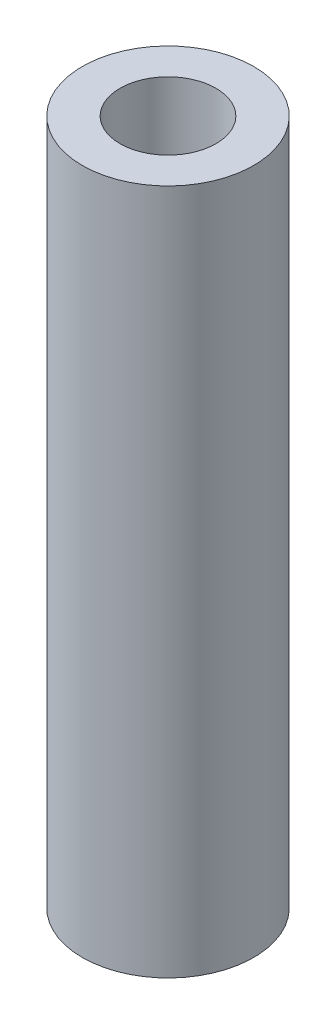
ISO-10303-21;
HEADER;
FILE_DESCRIPTION(('STEP AP214'),'2;1');
FILE_NAME('part.step','',(''),(''),'','','');
FILE_SCHEMA(('AUTOMOTIVE_DESIGN { 1 0 10303 214 1 1 1 1 }'));
ENDSEC;
DATA;
#1=APPLICATION_CONTEXT('core data for automotive mechanical design processes');
#2=APPLICATION_PROTOCOL_DEFINITION('international standard','automotive_design',2000,#1);
#3=PRODUCT_CONTEXT('',#1,'mechanical');
#4=PRODUCT('Part','Part','',(#3));
#5=PRODUCT_RELATED_PRODUCT_CATEGORY('part','',(#4));
#6=PRODUCT_DEFINITION_FORMATION('','',#4);
#7=PRODUCT_DEFINITION_CONTEXT('part definition',#1,'design');
#8=PRODUCT_DEFINITION('design','',#6,#7);
#9=PRODUCT_DEFINITION_SHAPE('','',#8);
#10=(LENGTH_UNIT() NAMED_UNIT(*) SI_UNIT(.MILLI.,.METRE.));
#11=(NAMED_UNIT(*) PLANE_ANGLE_UNIT() SI_UNIT($,.RADIAN.));
#12=(NAMED_UNIT(*) SI_UNIT($,.STERADIAN.) SOLID_ANGLE_UNIT());
#13=UNCERTAINTY_MEASURE_WITH_UNIT(LENGTH_MEASURE(1.E-05),#10,'distance_accuracy_value','');
#14=(GEOMETRIC_REPRESENTATION_CONTEXT(3) GLOBAL_UNCERTAINTY_ASSIGNED_CONTEXT((#13)) GLOBAL_UNIT_ASSIGNED_CONTEXT((#10,
#11,#12)) REPRESENTATION_CONTEXT('',''));
#15=CARTESIAN_POINT('',(0.,0.,0.));
#16=DIRECTION('',(0.,0.,1.));
#17=DIRECTION('',(1.,0.,0.));
#18=AXIS2_PLACEMENT_3D('',#15,#16,#17);
#19=CARTESIAN_POINT('',(0.,25.4,0.));
#20=DIRECTION('',(0.,1.,0.));
#21=DIRECTION('',(0.,0.,1.));
#22=AXIS2_PLACEMENT_3D('',#19,#20,#21);
#23=PLANE('',#22);
#24=CARTESIAN_POINT('',(0.,25.4,0.));
#25=DIRECTION('',(0.,1.,0.));
#26=DIRECTION('',(0.,0.,1.));
#27=AXIS2_PLACEMENT_3D('',#24,#25,#26);
#28=CIRCLE('',#27,3.175);
#29=CARTESIAN_POINT('',(0.,25.4,3.175));
#30=VERTEX_POINT('',#29);
#31=EDGE_CURVE('E10',#30,#30,#28,.T.);
#32=ORIENTED_EDGE('',*,*,#31,.T.);
#33=EDGE_LOOP('',(#32));
#34=FACE_BOUND('',#33,.T.);
#35=CARTESIAN_POINT('',(0.,25.4,0.));
#36=DIRECTION('',(0.,1.,0.));
#37=DIRECTION('',(0.,0.,1.));
#38=AXIS2_PLACEMENT_3D('',#35,#36,#37);
#39=CIRCLE('',#38,1.778);
#40=CARTESIAN_POINT('',(0.,25.4,1.778));
#41=VERTEX_POINT('',#40);
#42=EDGE_CURVE('E42',#41,#41,#39,.T.);
#43=ORIENTED_EDGE('',*,*,#42,.F.);
#44=EDGE_LOOP('',(#43));
#45=FACE_BOUND('',#44,.T.);
#46=ADVANCED_FACE('F31',(#34,#45),#23,.T.);
#47=CARTESIAN_POINT('',(0.,0.,0.));
#48=DIRECTION('',(0.,1.,0.));
#49=DIRECTION('',(0.,0.,1.));
#50=AXIS2_PLACEMENT_3D('',#47,#48,#49);
#51=PLANE('',#50);
#52=CARTESIAN_POINT('',(0.,0.,0.));
#53=DIRECTION('',(0.,1.,0.));
#54=DIRECTION('',(0.,0.,1.));
#55=AXIS2_PLACEMENT_3D('',#52,#53,#54);
#56=CIRCLE('',#55,3.175);
#57=CARTESIAN_POINT('',(0.,0.,3.175));
#58=VERTEX_POINT('',#57);
#59=EDGE_CURVE('E35',#58,#58,#56,.T.);
#60=ORIENTED_EDGE('',*,*,#59,.F.);
#61=EDGE_LOOP('',(#60));
#62=FACE_BOUND('',#61,.T.);
#63=CARTESIAN_POINT('',(0.,0.,0.));
#64=DIRECTION('',(0.,1.,0.));
#65=DIRECTION('',(0.,0.,1.));
#66=AXIS2_PLACEMENT_3D('',#63,#64,#65);
#67=CIRCLE('',#66,1.778);
#68=CARTESIAN_POINT('',(0.,0.,1.778));
#69=VERTEX_POINT('',#68);
#70=EDGE_CURVE('E44',#69,#69,#67,.T.);
#71=ORIENTED_EDGE('',*,*,#70,.T.);
#72=EDGE_LOOP('',(#71));
#73=FACE_BOUND('',#72,.T.);
#74=ADVANCED_FACE('F54',(#62,#73),#51,.F.);
#75=CARTESIAN_POINT('',(0.,25.4,0.));
#76=DIRECTION('',(0.,-1.,0.));
#77=DIRECTION('',(0.,0.,-1.));
#78=AXIS2_PLACEMENT_3D('',#75,#76,#77);
#79=CYLINDRICAL_SURFACE('',#78,3.175);
#80=ORIENTED_EDGE('',*,*,#31,.F.);
#81=EDGE_LOOP('',(#80));
#82=FACE_BOUND('',#81,.T.);
#83=ORIENTED_EDGE('',*,*,#59,.T.);
#84=EDGE_LOOP('',(#83));
#85=FACE_BOUND('',#84,.T.);
#86=ADVANCED_FACE('F33',(#82,#85),#79,.T.);
#87=CARTESIAN_POINT('',(0.,25.4,0.));
#88=DIRECTION('',(0.,-1.,0.));
#89=DIRECTION('',(0.,0.,-1.));
#90=AXIS2_PLACEMENT_3D('',#87,#88,#89);
#91=CYLINDRICAL_SURFACE('',#90,1.778);
#92=ORIENTED_EDGE('',*,*,#42,.T.);
#93=EDGE_LOOP('',(#92));
#94=FACE_BOUND('',#93,.T.);
#95=ORIENTED_EDGE('',*,*,#70,.F.);
#96=EDGE_LOOP('',(#95));
#97=FACE_BOUND('',#96,.T.);
#98=ADVANCED_FACE('F50',(#94,#97),#91,.F.);
#99=CLOSED_SHELL('',(#46,#74,#86,#98));
#100=MANIFOLD_SOLID_BREP('B2',#99);
#101=ADVANCED_BREP_SHAPE_REPRESENTATION('',(#18,#100),#14);
#102=SHAPE_DEFINITION_REPRESENTATION(#9,#101);
ENDSEC;
END-ISO-10303-21;
